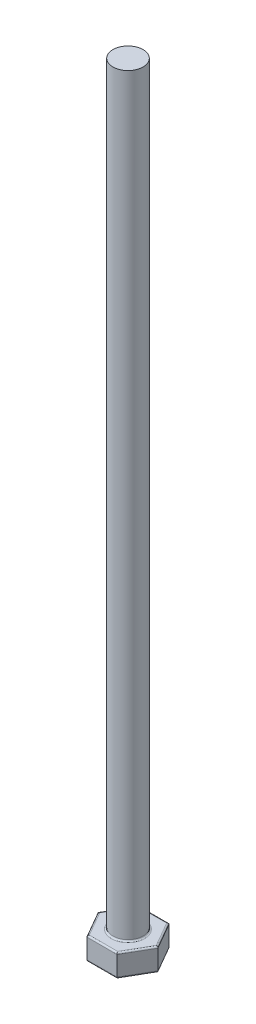
ISO-10303-21;
HEADER;
FILE_DESCRIPTION(('STEP AP214'),'2;1');
FILE_NAME('part.step','',(''),(''),'','','');
FILE_SCHEMA(('AUTOMOTIVE_DESIGN { 1 0 10303 214 1 1 1 1 }'));
ENDSEC;
DATA;
#1=APPLICATION_CONTEXT('core data for automotive mechanical design processes');
#2=APPLICATION_PROTOCOL_DEFINITION('international standard','automotive_design',2000,#1);
#3=PRODUCT_CONTEXT('',#1,'mechanical');
#4=PRODUCT('Part','Part','',(#3));
#5=PRODUCT_RELATED_PRODUCT_CATEGORY('part','',(#4));
#6=PRODUCT_DEFINITION_FORMATION('','',#4);
#7=PRODUCT_DEFINITION_CONTEXT('part definition',#1,'design');
#8=PRODUCT_DEFINITION('design','',#6,#7);
#9=PRODUCT_DEFINITION_SHAPE('','',#8);
#10=(LENGTH_UNIT() NAMED_UNIT(*) SI_UNIT(.MILLI.,.METRE.));
#11=(NAMED_UNIT(*) PLANE_ANGLE_UNIT() SI_UNIT($,.RADIAN.));
#12=(NAMED_UNIT(*) SI_UNIT($,.STERADIAN.) SOLID_ANGLE_UNIT());
#13=UNCERTAINTY_MEASURE_WITH_UNIT(LENGTH_MEASURE(1.E-05),#10,'distance_accuracy_value','');
#14=(GEOMETRIC_REPRESENTATION_CONTEXT(3) GLOBAL_UNCERTAINTY_ASSIGNED_CONTEXT((#13)) GLOBAL_UNIT_ASSIGNED_CONTEXT((#10,
#11,#12)) REPRESENTATION_CONTEXT('',''));
#15=CARTESIAN_POINT('',(0.,0.,0.));
#16=DIRECTION('',(0.,0.,1.));
#17=DIRECTION('',(1.,0.,0.));
#18=AXIS2_PLACEMENT_3D('',#15,#16,#17);
#19=CARTESIAN_POINT('',(0.,100.,0.));
#20=DIRECTION('',(0.,-1.,0.));
#21=DIRECTION('',(0.,0.,-1.));
#22=AXIS2_PLACEMENT_3D('',#19,#20,#21);
#23=CYLINDRICAL_SURFACE('',#22,2.);
#24=CARTESIAN_POINT('',(0.,0.200000000000006,0.));
#25=DIRECTION('',(0.,-1.,0.));
#26=DIRECTION('',(0.,0.,-1.));
#27=AXIS2_PLACEMENT_3D('',#24,#25,#26);
#28=CIRCLE('',#27,2.);
#29=CARTESIAN_POINT('',(0.,0.200000000000006,-2.));
#30=VERTEX_POINT('',#29);
#31=EDGE_CURVE('E11',#30,#30,#28,.F.);
#32=ORIENTED_EDGE('',*,*,#31,.T.);
#33=EDGE_LOOP('',(#32));
#34=FACE_BOUND('',#33,.T.);
#35=CARTESIAN_POINT('',(0.,100.,0.));
#36=DIRECTION('',(0.,1.,0.));
#37=DIRECTION('',(0.,0.,1.));
#38=AXIS2_PLACEMENT_3D('',#35,#36,#37);
#39=CIRCLE('',#38,2.);
#40=CARTESIAN_POINT('',(0.,100.,2.));
#41=VERTEX_POINT('',#40);
#42=EDGE_CURVE('E145',#41,#41,#39,.T.);
#43=ORIENTED_EDGE('',*,*,#42,.F.);
#44=EDGE_LOOP('',(#43));
#45=FACE_BOUND('',#44,.T.);
#46=ADVANCED_FACE('F34',(#34,#45),#23,.T.);
#47=CARTESIAN_POINT('',(0.,100.,0.));
#48=DIRECTION('',(0.,1.,0.));
#49=DIRECTION('',(0.,0.,1.));
#50=AXIS2_PLACEMENT_3D('',#47,#48,#49);
#51=PLANE('',#50);
#52=ORIENTED_EDGE('',*,*,#42,.T.);
#53=EDGE_LOOP('',(#52));
#54=FACE_BOUND('',#53,.T.);
#55=ADVANCED_FACE('F305',(#54),#51,.T.);
#56=CARTESIAN_POINT('',(1.99185842870421,-3.,-3.45));
#57=DIRECTION('',(-0.866025403784439,0.,0.5));
#58=DIRECTION('',(0.5,0.,0.866025403784439));
#59=AXIS2_PLACEMENT_3D('',#56,#57,#58);
#60=PLANE('',#59);
#61=DIRECTION('',(0.,1.,0.));
#62=VECTOR('',#61,1.);
#63=CARTESIAN_POINT('',(3.98371685740842,-3.,0.));
#64=LINE('',#63,#62);
#65=CARTESIAN_POINT('',(3.98371685740842,-2.8,0.));
#66=VERTEX_POINT('',#65);
#67=CARTESIAN_POINT('',(3.98371685740842,-0.2,0.));
#68=VERTEX_POINT('',#67);
#69=EDGE_CURVE('E242',#66,#68,#64,.T.);
#70=ORIENTED_EDGE('',*,*,#69,.F.);
#71=DIRECTION('',(0.5,0.,0.866025403784439));
#72=VECTOR('',#71,1.);
#73=CARTESIAN_POINT('',(1.99185842870421,-2.8,-3.45));
#74=LINE('',#73,#72);
#75=CARTESIAN_POINT('',(1.99185842870421,-2.8,-3.45));
#76=VERTEX_POINT('',#75);
#77=EDGE_CURVE('E178',#66,#76,#74,.F.);
#78=ORIENTED_EDGE('',*,*,#77,.T.);
#79=DIRECTION('',(0.,1.,0.));
#80=VECTOR('',#79,1.);
#81=CARTESIAN_POINT('',(1.99185842870421,-3.,-3.45));
#82=LINE('',#81,#80);
#83=CARTESIAN_POINT('',(1.99185842870421,-0.2,-3.45));
#84=VERTEX_POINT('',#83);
#85=EDGE_CURVE('E203',#76,#84,#82,.T.);
#86=ORIENTED_EDGE('',*,*,#85,.T.);
#87=DIRECTION('',(0.5,0.,0.866025403784439));
#88=VECTOR('',#87,1.);
#89=CARTESIAN_POINT('',(1.99185842870421,-0.2,-3.45));
#90=LINE('',#89,#88);
#91=EDGE_CURVE('E176',#84,#68,#90,.T.);
#92=ORIENTED_EDGE('',*,*,#91,.T.);
#93=EDGE_LOOP('',(#70,#78,#86,#92));
#94=FACE_BOUND('',#93,.T.);
#95=ADVANCED_FACE('F241',(#94),#60,.F.);
#96=CARTESIAN_POINT('',(3.98371685740842,-3.,0.));
#97=DIRECTION('',(-0.866025403784438,0.,-0.5));
#98=DIRECTION('',(-0.5,0.,0.866025403784439));
#99=AXIS2_PLACEMENT_3D('',#96,#97,#98);
#100=PLANE('',#99);
#101=DIRECTION('',(0.,1.,0.));
#102=VECTOR('',#101,1.);
#103=CARTESIAN_POINT('',(1.99185842870421,-3.,3.45));
#104=LINE('',#103,#102);
#105=CARTESIAN_POINT('',(1.99185842870421,-2.8,3.45));
#106=VERTEX_POINT('',#105);
#107=CARTESIAN_POINT('',(1.99185842870421,-0.2,3.45));
#108=VERTEX_POINT('',#107);
#109=EDGE_CURVE('E249',#106,#108,#104,.T.);
#110=ORIENTED_EDGE('',*,*,#109,.F.);
#111=DIRECTION('',(-0.5,0.,0.866025403784439));
#112=VECTOR('',#111,1.);
#113=CARTESIAN_POINT('',(3.98371685740842,-2.8,0.));
#114=LINE('',#113,#112);
#115=EDGE_CURVE('E174',#106,#66,#114,.F.);
#116=ORIENTED_EDGE('',*,*,#115,.T.);
#117=ORIENTED_EDGE('',*,*,#69,.T.);
#118=DIRECTION('',(-0.5,0.,0.866025403784439));
#119=VECTOR('',#118,1.);
#120=CARTESIAN_POINT('',(3.98371685740842,-0.2,0.));
#121=LINE('',#120,#119);
#122=EDGE_CURVE('E171',#68,#108,#121,.T.);
#123=ORIENTED_EDGE('',*,*,#122,.T.);
#124=EDGE_LOOP('',(#110,#116,#117,#123));
#125=FACE_BOUND('',#124,.T.);
#126=ADVANCED_FACE('F246',(#125),#100,.F.);
#127=CARTESIAN_POINT('',(1.99185842870421,-3.,3.45));
#128=DIRECTION('',(0.,0.,-1.));
#129=DIRECTION('',(-1.,0.,0.));
#130=AXIS2_PLACEMENT_3D('',#127,#128,#129);
#131=PLANE('',#130);
#132=DIRECTION('',(0.,1.,0.));
#133=VECTOR('',#132,1.);
#134=CARTESIAN_POINT('',(-1.99185842870421,-3.,3.45));
#135=LINE('',#134,#133);
#136=CARTESIAN_POINT('',(-1.99185842870421,-2.8,3.45));
#137=VERTEX_POINT('',#136);
#138=CARTESIAN_POINT('',(-1.99185842870421,-0.2,3.45));
#139=VERTEX_POINT('',#138);
#140=EDGE_CURVE('E253',#137,#139,#135,.T.);
#141=ORIENTED_EDGE('',*,*,#140,.F.);
#142=DIRECTION('',(-1.,0.,0.));
#143=VECTOR('',#142,1.);
#144=CARTESIAN_POINT('',(1.99185842870421,-2.8,3.45));
#145=LINE('',#144,#143);
#146=EDGE_CURVE('E169',#137,#106,#145,.F.);
#147=ORIENTED_EDGE('',*,*,#146,.T.);
#148=ORIENTED_EDGE('',*,*,#109,.T.);
#149=DIRECTION('',(-1.,0.,0.));
#150=VECTOR('',#149,1.);
#151=CARTESIAN_POINT('',(1.99185842870421,-0.2,3.45));
#152=LINE('',#151,#150);
#153=EDGE_CURVE('E167',#108,#139,#152,.T.);
#154=ORIENTED_EDGE('',*,*,#153,.T.);
#155=EDGE_LOOP('',(#141,#147,#148,#154));
#156=FACE_BOUND('',#155,.T.);
#157=ADVANCED_FACE('F335',(#156),#131,.F.);
#158=CARTESIAN_POINT('',(-1.99185842870421,-3.,3.45));
#159=DIRECTION('',(0.866025403784439,0.,-0.5));
#160=DIRECTION('',(-0.5,0.,-0.866025403784439));
#161=AXIS2_PLACEMENT_3D('',#158,#159,#160);
#162=PLANE('',#161);
#163=DIRECTION('',(0.,1.,0.));
#164=VECTOR('',#163,1.);
#165=CARTESIAN_POINT('',(-3.98371685740842,-3.,0.));
#166=LINE('',#165,#164);
#167=CARTESIAN_POINT('',(-3.98371685740842,-2.8,0.));
#168=VERTEX_POINT('',#167);
#169=CARTESIAN_POINT('',(-3.98371685740842,-0.2,0.));
#170=VERTEX_POINT('',#169);
#171=EDGE_CURVE('E278',#168,#170,#166,.T.);
#172=ORIENTED_EDGE('',*,*,#171,.F.);
#173=DIRECTION('',(-0.5,0.,-0.866025403784439));
#174=VECTOR('',#173,1.);
#175=CARTESIAN_POINT('',(-1.99185842870421,-2.8,3.45));
#176=LINE('',#175,#174);
#177=EDGE_CURVE('E165',#168,#137,#176,.F.);
#178=ORIENTED_EDGE('',*,*,#177,.T.);
#179=ORIENTED_EDGE('',*,*,#140,.T.);
#180=DIRECTION('',(-0.5,0.,-0.866025403784439));
#181=VECTOR('',#180,1.);
#182=CARTESIAN_POINT('',(-1.99185842870421,-0.2,3.45));
#183=LINE('',#182,#181);
#184=EDGE_CURVE('E163',#139,#170,#183,.T.);
#185=ORIENTED_EDGE('',*,*,#184,.T.);
#186=EDGE_LOOP('',(#172,#178,#179,#185));
#187=FACE_BOUND('',#186,.T.);
#188=ADVANCED_FACE('F285',(#187),#162,.F.);
#189=CARTESIAN_POINT('',(-3.98371685740842,-3.,0.));
#190=DIRECTION('',(0.866025403784438,0.,0.5));
#191=DIRECTION('',(0.5,0.,-0.866025403784439));
#192=AXIS2_PLACEMENT_3D('',#189,#190,#191);
#193=PLANE('',#192);
#194=DIRECTION('',(0.,1.,0.));
#195=VECTOR('',#194,1.);
#196=CARTESIAN_POINT('',(-1.99185842870421,-3.,-3.45));
#197=LINE('',#196,#195);
#198=CARTESIAN_POINT('',(-1.99185842870421,-2.8,-3.45));
#199=VERTEX_POINT('',#198);
#200=CARTESIAN_POINT('',(-1.99185842870421,-0.2,-3.45));
#201=VERTEX_POINT('',#200);
#202=EDGE_CURVE('E276',#199,#201,#197,.T.);
#203=ORIENTED_EDGE('',*,*,#202,.F.);
#204=DIRECTION('',(0.5,0.,-0.866025403784439));
#205=VECTOR('',#204,1.);
#206=CARTESIAN_POINT('',(-3.98371685740842,-2.8,0.));
#207=LINE('',#206,#205);
#208=EDGE_CURVE('E161',#199,#168,#207,.F.);
#209=ORIENTED_EDGE('',*,*,#208,.T.);
#210=ORIENTED_EDGE('',*,*,#171,.T.);
#211=DIRECTION('',(0.5,0.,-0.866025403784439));
#212=VECTOR('',#211,1.);
#213=CARTESIAN_POINT('',(-3.98371685740842,-0.2,0.));
#214=LINE('',#213,#212);
#215=EDGE_CURVE('E159',#170,#201,#214,.T.);
#216=ORIENTED_EDGE('',*,*,#215,.T.);
#217=EDGE_LOOP('',(#203,#209,#210,#216));
#218=FACE_BOUND('',#217,.T.);
#219=ADVANCED_FACE('F277',(#218),#193,.F.);
#220=CARTESIAN_POINT('',(-1.99185842870421,-3.,-3.45));
#221=DIRECTION('',(0.,0.,1.));
#222=DIRECTION('',(1.,0.,0.));
#223=AXIS2_PLACEMENT_3D('',#220,#221,#222);
#224=PLANE('',#223);
#225=ORIENTED_EDGE('',*,*,#85,.F.);
#226=DIRECTION('',(1.,0.,0.));
#227=VECTOR('',#226,1.);
#228=CARTESIAN_POINT('',(-1.99185842870421,-2.8,-3.45));
#229=LINE('',#228,#227);
#230=EDGE_CURVE('E132',#76,#199,#229,.F.);
#231=ORIENTED_EDGE('',*,*,#230,.T.);
#232=ORIENTED_EDGE('',*,*,#202,.T.);
#233=DIRECTION('',(1.,0.,0.));
#234=VECTOR('',#233,1.);
#235=CARTESIAN_POINT('',(-1.99185842870421,-0.2,-3.45));
#236=LINE('',#235,#234);
#237=EDGE_CURVE('E151',#201,#84,#236,.T.);
#238=ORIENTED_EDGE('',*,*,#237,.T.);
#239=EDGE_LOOP('',(#225,#231,#232,#238));
#240=FACE_BOUND('',#239,.T.);
#241=ADVANCED_FACE('F275',(#240),#224,.F.);
#242=CARTESIAN_POINT('',(0.,-3.,0.));
#243=DIRECTION('',(0.,-1.,0.));
#244=DIRECTION('',(0.,0.,-1.));
#245=AXIS2_PLACEMENT_3D('',#242,#243,#244);
#246=PLANE('',#245);
#247=DIRECTION('',(0.5,0.,-0.866025403784439));
#248=VECTOR('',#247,1.);
#249=CARTESIAN_POINT('',(-1.81865334794732,-3.,-3.35));
#250=LINE('',#249,#248);
#251=CARTESIAN_POINT('',(-3.75277674973257,-3.,0.));
#252=VERTEX_POINT('',#251);
#253=CARTESIAN_POINT('',(-1.87638837486628,-3.,-3.25));
#254=VERTEX_POINT('',#253);
#255=EDGE_CURVE('E149',#252,#254,#250,.T.);
#256=ORIENTED_EDGE('',*,*,#255,.T.);
#257=DIRECTION('',(1.,0.,0.));
#258=VECTOR('',#257,1.);
#259=CARTESIAN_POINT('',(1.99185842870421,-3.,-3.25));
#260=LINE('',#259,#258);
#261=CARTESIAN_POINT('',(1.87638837486628,-3.,-3.25));
#262=VERTEX_POINT('',#261);
#263=EDGE_CURVE('E130',#254,#262,#260,.T.);
#264=ORIENTED_EDGE('',*,*,#263,.T.);
#265=DIRECTION('',(0.5,0.,0.866025403784439));
#266=VECTOR('',#265,1.);
#267=CARTESIAN_POINT('',(3.81051177665153,-3.,0.100000000000001));
#268=LINE('',#267,#266);
#269=CARTESIAN_POINT('',(3.75277674973257,-3.,0.));
#270=VERTEX_POINT('',#269);
#271=EDGE_CURVE('E138',#262,#270,#268,.T.);
#272=ORIENTED_EDGE('',*,*,#271,.T.);
#273=DIRECTION('',(-0.5,0.,0.866025403784439));
#274=VECTOR('',#273,1.);
#275=CARTESIAN_POINT('',(1.81865334794732,-3.,3.35));
#276=LINE('',#275,#274);
#277=CARTESIAN_POINT('',(1.87638837486628,-3.,3.25));
#278=VERTEX_POINT('',#277);
#279=EDGE_CURVE('E144',#270,#278,#276,.T.);
#280=ORIENTED_EDGE('',*,*,#279,.T.);
#281=DIRECTION('',(-1.,0.,0.));
#282=VECTOR('',#281,1.);
#283=CARTESIAN_POINT('',(-1.99185842870421,-3.,3.25));
#284=LINE('',#283,#282);
#285=CARTESIAN_POINT('',(-1.87638837486628,-3.,3.25));
#286=VERTEX_POINT('',#285);
#287=EDGE_CURVE('E258',#278,#286,#284,.T.);
#288=ORIENTED_EDGE('',*,*,#287,.T.);
#289=DIRECTION('',(-0.5,0.,-0.866025403784439));
#290=VECTOR('',#289,1.);
#291=CARTESIAN_POINT('',(-3.81051177665153,-3.,-0.1));
#292=LINE('',#291,#290);
#293=EDGE_CURVE('E154',#286,#252,#292,.T.);
#294=ORIENTED_EDGE('',*,*,#293,.T.);
#295=EDGE_LOOP('',(#256,#264,#272,#280,#288,#294));
#296=FACE_BOUND('',#295,.T.);
#297=ADVANCED_FACE('F147',(#296),#246,.T.);
#298=CARTESIAN_POINT('',(0.,0.,0.));
#299=DIRECTION('',(0.,-1.,0.));
#300=DIRECTION('',(0.,0.,-1.));
#301=AXIS2_PLACEMENT_3D('',#298,#299,#300);
#302=PLANE('',#301);
#303=DIRECTION('',(-1.,0.,0.));
#304=VECTOR('',#303,1.);
#305=CARTESIAN_POINT('',(0.,0.,3.25));
#306=LINE('',#305,#304);
#307=CARTESIAN_POINT('',(-1.87638837486628,0.,3.25));
#308=VERTEX_POINT('',#307);
#309=CARTESIAN_POINT('',(1.87638837486628,0.,3.25));
#310=VERTEX_POINT('',#309);
#311=EDGE_CURVE('E51',#308,#310,#306,.F.);
#312=ORIENTED_EDGE('',*,*,#311,.T.);
#313=DIRECTION('',(-0.5,0.,0.866025403784439));
#314=VECTOR('',#313,1.);
#315=CARTESIAN_POINT('',(2.81458256229942,0.,1.625));
#316=LINE('',#315,#314);
#317=CARTESIAN_POINT('',(3.75277674973257,0.,0.));
#318=VERTEX_POINT('',#317);
#319=EDGE_CURVE('E43',#310,#318,#316,.F.);
#320=ORIENTED_EDGE('',*,*,#319,.T.);
#321=DIRECTION('',(0.5,0.,0.866025403784439));
#322=VECTOR('',#321,1.);
#323=CARTESIAN_POINT('',(2.81458256229943,0.,-1.625));
#324=LINE('',#323,#322);
#325=CARTESIAN_POINT('',(1.87638837486628,0.,-3.25));
#326=VERTEX_POINT('',#325);
#327=EDGE_CURVE('E183',#318,#326,#324,.F.);
#328=ORIENTED_EDGE('',*,*,#327,.T.);
#329=DIRECTION('',(1.,0.,0.));
#330=VECTOR('',#329,1.);
#331=CARTESIAN_POINT('',(0.,0.,-3.25));
#332=LINE('',#331,#330);
#333=CARTESIAN_POINT('',(-1.87638837486628,0.,-3.25));
#334=VERTEX_POINT('',#333);
#335=EDGE_CURVE('E185',#326,#334,#332,.F.);
#336=ORIENTED_EDGE('',*,*,#335,.T.);
#337=DIRECTION('',(0.5,0.,-0.866025403784439));
#338=VECTOR('',#337,1.);
#339=CARTESIAN_POINT('',(-2.81458256229942,0.,-1.625));
#340=LINE('',#339,#338);
#341=CARTESIAN_POINT('',(-3.75277674973257,0.,0.));
#342=VERTEX_POINT('',#341);
#343=EDGE_CURVE('E187',#334,#342,#340,.F.);
#344=ORIENTED_EDGE('',*,*,#343,.T.);
#345=DIRECTION('',(-0.5,0.,-0.866025403784439));
#346=VECTOR('',#345,1.);
#347=CARTESIAN_POINT('',(-2.81458256229943,0.,1.625));
#348=LINE('',#347,#346);
#349=EDGE_CURVE('E56',#342,#308,#348,.F.);
#350=ORIENTED_EDGE('',*,*,#349,.T.);
#351=EDGE_LOOP('',(#312,#320,#328,#336,#344,#350));
#352=FACE_BOUND('',#351,.T.);
#353=CARTESIAN_POINT('',(0.,0.,0.));
#354=DIRECTION('',(0.,-1.,0.));
#355=DIRECTION('',(0.,0.,-1.));
#356=AXIS2_PLACEMENT_3D('',#353,#354,#355);
#357=CIRCLE('',#356,2.2);
#358=CARTESIAN_POINT('',(0.,0.,-2.2));
#359=VERTEX_POINT('',#358);
#360=EDGE_CURVE('E180',#359,#359,#357,.T.);
#361=ORIENTED_EDGE('',*,*,#360,.T.);
#362=EDGE_LOOP('',(#361));
#363=FACE_BOUND('',#362,.T.);
#364=ADVANCED_FACE('F229',(#352,#363),#302,.F.);
#365=CARTESIAN_POINT('',(0.,-2.8,3.25));
#366=DIRECTION('',(1.,0.,0.));
#367=DIRECTION('',(0.,0.,-1.));
#368=AXIS2_PLACEMENT_3D('',#365,#366,#367);
#369=CYLINDRICAL_SURFACE('',#368,0.2);
#370=CARTESIAN_POINT('',(1.87638837486628,-2.8,3.25));
#371=DIRECTION('',(0.866025403784439,0.,-0.5));
#372=DIRECTION('',(-0.5,0.,-0.866025403784439));
#373=AXIS2_PLACEMENT_3D('',#370,#371,#372);
#374=ELLIPSE('',#373,0.23094010767585,0.2);
#375=EDGE_CURVE('E197',#106,#278,#374,.T.);
#376=ORIENTED_EDGE('',*,*,#375,.F.);
#377=ORIENTED_EDGE('',*,*,#146,.F.);
#378=CARTESIAN_POINT('',(-1.87638837486628,-2.8,3.25));
#379=DIRECTION('',(0.866025403784439,0.,0.5));
#380=DIRECTION('',(0.5,0.,-0.866025403784439));
#381=AXIS2_PLACEMENT_3D('',#378,#379,#380);
#382=ELLIPSE('',#381,0.23094010767585,0.2);
#383=EDGE_CURVE('E200',#286,#137,#382,.F.);
#384=ORIENTED_EDGE('',*,*,#383,.F.);
#385=ORIENTED_EDGE('',*,*,#287,.F.);
#386=EDGE_LOOP('',(#376,#377,#384,#385));
#387=FACE_BOUND('',#386,.T.);
#388=ADVANCED_FACE('F327',(#387),#369,.T.);
#389=CARTESIAN_POINT('',(-2.81458256229943,-2.8,1.625));
#390=DIRECTION('',(0.5,0.,0.866025403784439));
#391=DIRECTION('',(0.866025403784439,0.,-0.5));
#392=AXIS2_PLACEMENT_3D('',#389,#390,#391);
#393=CYLINDRICAL_SURFACE('',#392,0.2);
#394=ORIENTED_EDGE('',*,*,#383,.T.);
#395=ORIENTED_EDGE('',*,*,#177,.F.);
#396=CARTESIAN_POINT('',(-3.75277674973257,-2.8,0.));
#397=DIRECTION('',(0.,0.,1.));
#398=DIRECTION('',(1.,0.,0.));
#399=AXIS2_PLACEMENT_3D('',#396,#397,#398);
#400=ELLIPSE('',#399,0.23094010767585,0.2);
#401=EDGE_CURVE('E194',#252,#168,#400,.F.);
#402=ORIENTED_EDGE('',*,*,#401,.F.);
#403=ORIENTED_EDGE('',*,*,#293,.F.);
#404=EDGE_LOOP('',(#394,#395,#402,#403));
#405=FACE_BOUND('',#404,.T.);
#406=ADVANCED_FACE('F265',(#405),#393,.T.);
#407=CARTESIAN_POINT('',(2.81458256229942,-2.8,1.625));
#408=DIRECTION('',(0.5,0.,-0.866025403784439));
#409=DIRECTION('',(-0.866025403784438,0.,-0.5));
#410=AXIS2_PLACEMENT_3D('',#407,#408,#409);
#411=CYLINDRICAL_SURFACE('',#410,0.2);
#412=ORIENTED_EDGE('',*,*,#375,.T.);
#413=ORIENTED_EDGE('',*,*,#279,.F.);
#414=CARTESIAN_POINT('',(3.75277674973257,-2.8,0.));
#415=DIRECTION('',(0.,0.,-1.));
#416=DIRECTION('',(-1.,0.,0.));
#417=AXIS2_PLACEMENT_3D('',#414,#415,#416);
#418=ELLIPSE('',#417,0.23094010767585,0.2);
#419=EDGE_CURVE('E141',#66,#270,#418,.T.);
#420=ORIENTED_EDGE('',*,*,#419,.F.);
#421=ORIENTED_EDGE('',*,*,#115,.F.);
#422=EDGE_LOOP('',(#412,#413,#420,#421));
#423=FACE_BOUND('',#422,.T.);
#424=ADVANCED_FACE('F322',(#423),#411,.T.);
#425=CARTESIAN_POINT('',(-2.81458256229942,-2.8,-1.625));
#426=DIRECTION('',(-0.5,0.,0.866025403784439));
#427=DIRECTION('',(0.866025403784438,0.,0.5));
#428=AXIS2_PLACEMENT_3D('',#425,#426,#427);
#429=CYLINDRICAL_SURFACE('',#428,0.2);
#430=ORIENTED_EDGE('',*,*,#401,.T.);
#431=ORIENTED_EDGE('',*,*,#208,.F.);
#432=CARTESIAN_POINT('',(-1.87638837486628,-2.8,-3.25));
#433=DIRECTION('',(-0.866025403784439,0.,0.5));
#434=DIRECTION('',(0.5,0.,0.866025403784439));
#435=AXIS2_PLACEMENT_3D('',#432,#433,#434);
#436=ELLIPSE('',#435,0.23094010767585,0.2);
#437=EDGE_CURVE('E135',#254,#199,#436,.F.);
#438=ORIENTED_EDGE('',*,*,#437,.F.);
#439=ORIENTED_EDGE('',*,*,#255,.F.);
#440=EDGE_LOOP('',(#430,#431,#438,#439));
#441=FACE_BOUND('',#440,.T.);
#442=ADVANCED_FACE('F268',(#441),#429,.T.);
#443=CARTESIAN_POINT('',(2.81458256229943,-2.8,-1.625));
#444=DIRECTION('',(-0.5,0.,-0.866025403784439));
#445=DIRECTION('',(-0.866025403784439,0.,0.5));
#446=AXIS2_PLACEMENT_3D('',#443,#444,#445);
#447=CYLINDRICAL_SURFACE('',#446,0.2);
#448=ORIENTED_EDGE('',*,*,#419,.T.);
#449=ORIENTED_EDGE('',*,*,#271,.F.);
#450=CARTESIAN_POINT('',(1.87638837486628,-2.8,-3.25));
#451=DIRECTION('',(-0.866025403784439,0.,-0.5));
#452=DIRECTION('',(0.5,0.,-0.866025403784439));
#453=AXIS2_PLACEMENT_3D('',#450,#451,#452);
#454=ELLIPSE('',#453,0.23094010767585,0.2);
#455=EDGE_CURVE('E126',#76,#262,#454,.T.);
#456=ORIENTED_EDGE('',*,*,#455,.F.);
#457=ORIENTED_EDGE('',*,*,#77,.F.);
#458=EDGE_LOOP('',(#448,#449,#456,#457));
#459=FACE_BOUND('',#458,.T.);
#460=ADVANCED_FACE('F139',(#459),#447,.T.);
#461=CARTESIAN_POINT('',(0.,-2.8,-3.25));
#462=DIRECTION('',(-1.,0.,0.));
#463=DIRECTION('',(0.,0.,1.));
#464=AXIS2_PLACEMENT_3D('',#461,#462,#463);
#465=CYLINDRICAL_SURFACE('',#464,0.2);
#466=ORIENTED_EDGE('',*,*,#437,.T.);
#467=ORIENTED_EDGE('',*,*,#230,.F.);
#468=ORIENTED_EDGE('',*,*,#455,.T.);
#469=ORIENTED_EDGE('',*,*,#263,.F.);
#470=EDGE_LOOP('',(#466,#467,#468,#469));
#471=FACE_BOUND('',#470,.T.);
#472=ADVANCED_FACE('F128',(#471),#465,.T.);
#473=CARTESIAN_POINT('',(-3.81051177665153,-0.2,0.1));
#474=DIRECTION('',(0.5,0.,-0.866025403784439));
#475=DIRECTION('',(-0.866025403784438,0.,-0.5));
#476=AXIS2_PLACEMENT_3D('',#473,#474,#475);
#477=CYLINDRICAL_SURFACE('',#476,0.2);
#478=CARTESIAN_POINT('',(-3.75277674973257,-0.2,0.));
#479=DIRECTION('',(0.,0.,-1.));
#480=DIRECTION('',(1.,0.,0.));
#481=AXIS2_PLACEMENT_3D('',#478,#479,#480);
#482=ELLIPSE('',#481,0.23094010767585,0.2);
#483=EDGE_CURVE('E213',#342,#170,#482,.F.);
#484=ORIENTED_EDGE('',*,*,#483,.F.);
#485=ORIENTED_EDGE('',*,*,#343,.F.);
#486=CARTESIAN_POINT('',(-1.87638837486628,-0.2,-3.25));
#487=DIRECTION('',(0.866025403784439,0.,-0.5));
#488=DIRECTION('',(0.5,0.,0.866025403784439));
#489=AXIS2_PLACEMENT_3D('',#486,#487,#488);
#490=ELLIPSE('',#489,0.23094010767585,0.2);
#491=EDGE_CURVE('E38',#201,#334,#490,.T.);
#492=ORIENTED_EDGE('',*,*,#491,.F.);
#493=ORIENTED_EDGE('',*,*,#215,.F.);
#494=EDGE_LOOP('',(#484,#485,#492,#493));
#495=FACE_BOUND('',#494,.T.);
#496=ADVANCED_FACE('F228',(#495),#477,.T.);
#497=CARTESIAN_POINT('',(-1.99185842870421,-0.2,-3.25));
#498=DIRECTION('',(1.,0.,0.));
#499=DIRECTION('',(0.,0.,-1.));
#500=AXIS2_PLACEMENT_3D('',#497,#498,#499);
#501=CYLINDRICAL_SURFACE('',#500,0.2);
#502=ORIENTED_EDGE('',*,*,#491,.T.);
#503=ORIENTED_EDGE('',*,*,#335,.F.);
#504=CARTESIAN_POINT('',(1.87638837486628,-0.2,-3.25));
#505=DIRECTION('',(0.866025403784439,0.,0.5));
#506=DIRECTION('',(-0.5,0.,0.866025403784439));
#507=AXIS2_PLACEMENT_3D('',#504,#505,#506);
#508=ELLIPSE('',#507,0.23094010767585,0.2);
#509=EDGE_CURVE('E211',#84,#326,#508,.T.);
#510=ORIENTED_EDGE('',*,*,#509,.F.);
#511=ORIENTED_EDGE('',*,*,#237,.F.);
#512=EDGE_LOOP('',(#502,#503,#510,#511));
#513=FACE_BOUND('',#512,.T.);
#514=ADVANCED_FACE('F223',(#513),#501,.T.);
#515=CARTESIAN_POINT('',(-1.81865334794732,-0.2,3.35));
#516=DIRECTION('',(-0.5,0.,-0.866025403784439));
#517=DIRECTION('',(-0.866025403784439,0.,0.5));
#518=AXIS2_PLACEMENT_3D('',#515,#516,#517);
#519=CYLINDRICAL_SURFACE('',#518,0.2);
#520=ORIENTED_EDGE('',*,*,#483,.T.);
#521=ORIENTED_EDGE('',*,*,#184,.F.);
#522=CARTESIAN_POINT('',(-1.87638837486628,-0.2,3.25));
#523=DIRECTION('',(-0.866025403784439,0.,-0.5));
#524=DIRECTION('',(0.5,0.,-0.866025403784439));
#525=AXIS2_PLACEMENT_3D('',#522,#523,#524);
#526=ELLIPSE('',#525,0.23094010767585,0.2);
#527=EDGE_CURVE('E208',#308,#139,#526,.F.);
#528=ORIENTED_EDGE('',*,*,#527,.F.);
#529=ORIENTED_EDGE('',*,*,#349,.F.);
#530=EDGE_LOOP('',(#520,#521,#528,#529));
#531=FACE_BOUND('',#530,.T.);
#532=ADVANCED_FACE('F288',(#531),#519,.T.);
#533=CARTESIAN_POINT('',(1.81865334794732,-0.2,-3.35));
#534=DIRECTION('',(0.5,0.,0.866025403784439));
#535=DIRECTION('',(0.866025403784439,0.,-0.5));
#536=AXIS2_PLACEMENT_3D('',#533,#534,#535);
#537=CYLINDRICAL_SURFACE('',#536,0.2);
#538=ORIENTED_EDGE('',*,*,#509,.T.);
#539=ORIENTED_EDGE('',*,*,#327,.F.);
#540=CARTESIAN_POINT('',(3.75277674973257,-0.2,0.));
#541=DIRECTION('',(0.,0.,1.));
#542=DIRECTION('',(1.,0.,0.));
#543=AXIS2_PLACEMENT_3D('',#540,#541,#542);
#544=ELLIPSE('',#543,0.23094010767585,0.2);
#545=EDGE_CURVE('E206',#68,#318,#544,.T.);
#546=ORIENTED_EDGE('',*,*,#545,.F.);
#547=ORIENTED_EDGE('',*,*,#91,.F.);
#548=EDGE_LOOP('',(#538,#539,#546,#547));
#549=FACE_BOUND('',#548,.T.);
#550=ADVANCED_FACE('F234',(#549),#537,.T.);
#551=CARTESIAN_POINT('',(1.99185842870421,-0.2,3.25));
#552=DIRECTION('',(-1.,0.,0.));
#553=DIRECTION('',(0.,0.,1.));
#554=AXIS2_PLACEMENT_3D('',#551,#552,#553);
#555=CYLINDRICAL_SURFACE('',#554,0.2);
#556=ORIENTED_EDGE('',*,*,#527,.T.);
#557=ORIENTED_EDGE('',*,*,#153,.F.);
#558=CARTESIAN_POINT('',(1.87638837486628,-0.2,3.25));
#559=DIRECTION('',(-0.866025403784439,0.,0.5));
#560=DIRECTION('',(-0.5,0.,-0.866025403784439));
#561=AXIS2_PLACEMENT_3D('',#558,#559,#560);
#562=ELLIPSE('',#561,0.23094010767585,0.2);
#563=EDGE_CURVE('E204',#310,#108,#562,.F.);
#564=ORIENTED_EDGE('',*,*,#563,.F.);
#565=ORIENTED_EDGE('',*,*,#311,.F.);
#566=EDGE_LOOP('',(#556,#557,#564,#565));
#567=FACE_BOUND('',#566,.T.);
#568=ADVANCED_FACE('F291',(#567),#555,.T.);
#569=CARTESIAN_POINT('',(3.81051177665153,-0.2,-0.0999999999999996));
#570=DIRECTION('',(-0.5,0.,0.866025403784439));
#571=DIRECTION('',(0.866025403784438,0.,0.5));
#572=AXIS2_PLACEMENT_3D('',#569,#570,#571);
#573=CYLINDRICAL_SURFACE('',#572,0.2);
#574=ORIENTED_EDGE('',*,*,#545,.T.);
#575=ORIENTED_EDGE('',*,*,#319,.F.);
#576=ORIENTED_EDGE('',*,*,#563,.T.);
#577=ORIENTED_EDGE('',*,*,#122,.F.);
#578=EDGE_LOOP('',(#574,#575,#576,#577));
#579=FACE_BOUND('',#578,.T.);
#580=ADVANCED_FACE('F294',(#579),#573,.T.);
#581=CARTESIAN_POINT('',(0.,0.200000000000006,0.));
#582=DIRECTION('',(0.,-1.,0.));
#583=DIRECTION('',(0.,0.,-1.));
#584=AXIS2_PLACEMENT_3D('',#581,#582,#583);
#585=TOROIDAL_SURFACE('',#584,2.2,0.2);
#586=ORIENTED_EDGE('',*,*,#360,.F.);
#587=EDGE_LOOP('',(#586));
#588=FACE_BOUND('',#587,.T.);
#589=ORIENTED_EDGE('',*,*,#31,.F.);
#590=EDGE_LOOP('',(#589));
#591=FACE_BOUND('',#590,.T.);
#592=ADVANCED_FACE('F36',(#588,#591),#585,.F.);
#593=CLOSED_SHELL('',(#46,#55,#95,#126,#157,#188,#219,#241,#297,#364,#388,#406,#424,#442,#460,
#472,#496,#514,#532,#550,#568,#580,#592));
#594=MANIFOLD_SOLID_BREP('B2',#593);
#595=ADVANCED_BREP_SHAPE_REPRESENTATION('',(#18,#594),#14);
#596=SHAPE_DEFINITION_REPRESENTATION(#9,#595);
ENDSEC;
END-ISO-10303-21;
